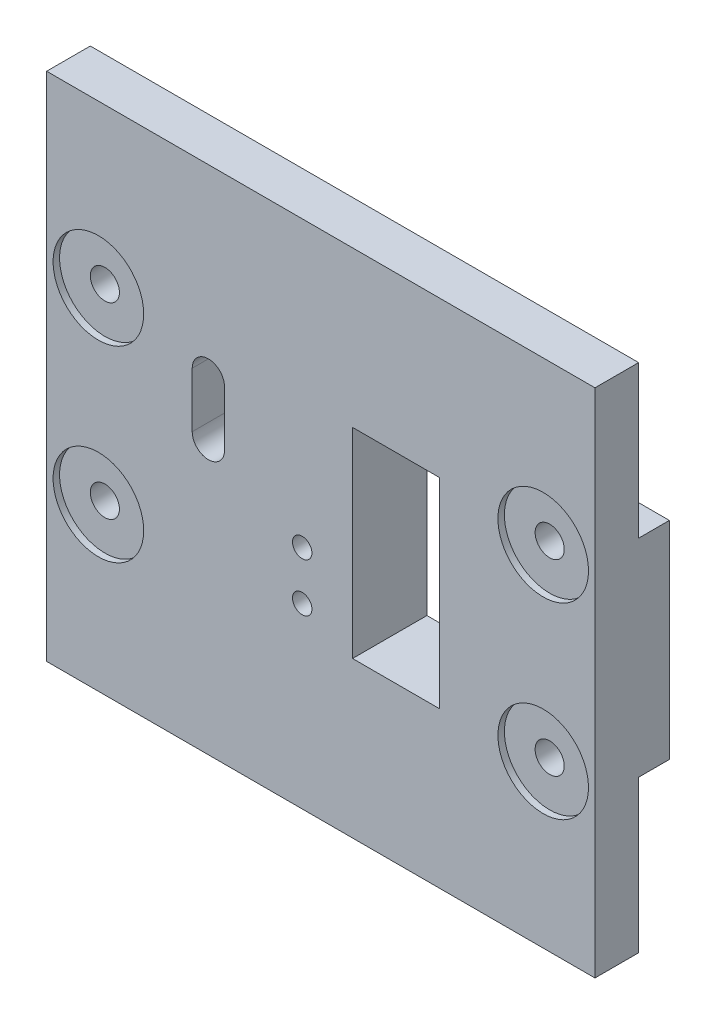
ISO-10303-21;
HEADER;
FILE_DESCRIPTION(('STEP AP214'),'2;1');
FILE_NAME('part.step','',(''),(''),'','','');
FILE_SCHEMA(('AUTOMOTIVE_DESIGN { 1 0 10303 214 1 1 1 1 }'));
ENDSEC;
DATA;
#1=APPLICATION_CONTEXT('core data for automotive mechanical design processes');
#2=APPLICATION_PROTOCOL_DEFINITION('international standard','automotive_design',2000,#1);
#3=PRODUCT_CONTEXT('',#1,'mechanical');
#4=PRODUCT('Part','Part','',(#3));
#5=PRODUCT_RELATED_PRODUCT_CATEGORY('part','',(#4));
#6=PRODUCT_DEFINITION_FORMATION('','',#4);
#7=PRODUCT_DEFINITION_CONTEXT('part definition',#1,'design');
#8=PRODUCT_DEFINITION('design','',#6,#7);
#9=PRODUCT_DEFINITION_SHAPE('','',#8);
#10=(LENGTH_UNIT() NAMED_UNIT(*) SI_UNIT(.MILLI.,.METRE.));
#11=(NAMED_UNIT(*) PLANE_ANGLE_UNIT() SI_UNIT($,.RADIAN.));
#12=(NAMED_UNIT(*) SI_UNIT($,.STERADIAN.) SOLID_ANGLE_UNIT());
#13=UNCERTAINTY_MEASURE_WITH_UNIT(LENGTH_MEASURE(1.E-05),#10,'distance_accuracy_value','');
#14=(GEOMETRIC_REPRESENTATION_CONTEXT(3) GLOBAL_UNCERTAINTY_ASSIGNED_CONTEXT((#13)) GLOBAL_UNIT_ASSIGNED_CONTEXT((#10,
#11,#12)) REPRESENTATION_CONTEXT('',''));
#15=CARTESIAN_POINT('',(0.,0.,0.));
#16=DIRECTION('',(0.,0.,1.));
#17=DIRECTION('',(1.,0.,0.));
#18=AXIS2_PLACEMENT_3D('',#15,#16,#17);
#19=CARTESIAN_POINT('',(0.,0.,23.));
#20=DIRECTION('',(0.,0.,-1.));
#21=DIRECTION('',(-1.,0.,0.));
#22=AXIS2_PLACEMENT_3D('',#19,#20,#21);
#23=PLANE('',#22);
#24=CARTESIAN_POINT('',(103.5,-29.,23.));
#25=DIRECTION('',(0.,0.,1.));
#26=DIRECTION('',(1.,0.,0.));
#27=AXIS2_PLACEMENT_3D('',#24,#25,#26);
#28=CIRCLE('',#27,14.);
#29=CARTESIAN_POINT('',(117.5,-29.,23.));
#30=VERTEX_POINT('',#29);
#31=EDGE_CURVE('E206',#30,#30,#28,.T.);
#32=ORIENTED_EDGE('',*,*,#31,.F.);
#33=EDGE_LOOP('',(#32));
#34=FACE_BOUND('',#33,.T.);
#35=CARTESIAN_POINT('',(-34.,29.0000000000001,23.));
#36=DIRECTION('',(0.,0.,1.));
#37=DIRECTION('',(1.,0.,0.));
#38=AXIS2_PLACEMENT_3D('',#35,#36,#37);
#39=CIRCLE('',#38,14.);
#40=CARTESIAN_POINT('',(-20.,29.0000000000001,23.));
#41=VERTEX_POINT('',#40);
#42=EDGE_CURVE('E213',#41,#41,#39,.T.);
#43=ORIENTED_EDGE('',*,*,#42,.F.);
#44=EDGE_LOOP('',(#43));
#45=FACE_BOUND('',#44,.T.);
#46=CARTESIAN_POINT('',(-34.,-29.,23.));
#47=DIRECTION('',(0.,0.,1.));
#48=DIRECTION('',(1.,0.,0.));
#49=AXIS2_PLACEMENT_3D('',#46,#47,#48);
#50=CIRCLE('',#49,14.);
#51=CARTESIAN_POINT('',(-20.,-29.,23.));
#52=VERTEX_POINT('',#51);
#53=EDGE_CURVE('E200',#52,#52,#50,.T.);
#54=ORIENTED_EDGE('',*,*,#53,.F.);
#55=EDGE_LOOP('',(#54));
#56=FACE_BOUND('',#55,.T.);
#57=CARTESIAN_POINT('',(103.5,29.0000000000001,23.));
#58=DIRECTION('',(0.,0.,1.));
#59=DIRECTION('',(1.,0.,0.));
#60=AXIS2_PLACEMENT_3D('',#57,#58,#59);
#61=CIRCLE('',#60,14.);
#62=CARTESIAN_POINT('',(117.5,29.0000000000001,23.));
#63=VERTEX_POINT('',#62);
#64=EDGE_CURVE('E209',#63,#63,#61,.T.);
#65=ORIENTED_EDGE('',*,*,#64,.F.);
#66=EDGE_LOOP('',(#65));
#67=FACE_BOUND('',#66,.T.);
#68=DIRECTION('',(0.,-1.,0.));
#69=VECTOR('',#68,1.);
#70=CARTESIAN_POINT('',(44.56,30.94,23.));
#71=LINE('',#70,#69);
#72=CARTESIAN_POINT('',(44.56,30.94,23.));
#73=VERTEX_POINT('',#72);
#74=CARTESIAN_POINT('',(44.56,-30.94,23.));
#75=VERTEX_POINT('',#74);
#76=EDGE_CURVE('E306',#73,#75,#71,.T.);
#77=ORIENTED_EDGE('',*,*,#76,.F.);
#78=DIRECTION('',(-1.,0.,0.));
#79=VECTOR('',#78,1.);
#80=CARTESIAN_POINT('',(71.44,30.94,23.));
#81=LINE('',#80,#79);
#82=CARTESIAN_POINT('',(71.44,30.94,23.));
#83=VERTEX_POINT('',#82);
#84=EDGE_CURVE('E314',#83,#73,#81,.T.);
#85=ORIENTED_EDGE('',*,*,#84,.F.);
#86=DIRECTION('',(0.,1.,0.));
#87=VECTOR('',#86,1.);
#88=CARTESIAN_POINT('',(71.44,-30.94,23.));
#89=LINE('',#88,#87);
#90=CARTESIAN_POINT('',(71.44,-30.94,23.));
#91=VERTEX_POINT('',#90);
#92=EDGE_CURVE('E311',#91,#83,#89,.T.);
#93=ORIENTED_EDGE('',*,*,#92,.F.);
#94=DIRECTION('',(1.,0.,0.));
#95=VECTOR('',#94,1.);
#96=CARTESIAN_POINT('',(44.56,-30.94,23.));
#97=LINE('',#96,#95);
#98=EDGE_CURVE('E308',#75,#91,#97,.T.);
#99=ORIENTED_EDGE('',*,*,#98,.F.);
#100=EDGE_LOOP('',(#77,#85,#93,#99));
#101=FACE_BOUND('',#100,.T.);
#102=DIRECTION('',(0.,-1.,0.));
#103=VECTOR('',#102,1.);
#104=CARTESIAN_POINT('',(-50.,-79.,23.));
#105=LINE('',#104,#103);
#106=CARTESIAN_POINT('',(-50.,79.0000000000001,23.));
#107=VERTEX_POINT('',#106);
#108=CARTESIAN_POINT('',(-50.,-79.,23.));
#109=VERTEX_POINT('',#108);
#110=EDGE_CURVE('E349',#107,#109,#105,.T.);
#111=ORIENTED_EDGE('',*,*,#110,.T.);
#112=DIRECTION('',(1.,0.,0.));
#113=VECTOR('',#112,1.);
#114=CARTESIAN_POINT('',(-50.,-79.,23.));
#115=LINE('',#114,#113);
#116=CARTESIAN_POINT('',(119.5,-79.,23.));
#117=VERTEX_POINT('',#116);
#118=EDGE_CURVE('E352',#109,#117,#115,.T.);
#119=ORIENTED_EDGE('',*,*,#118,.T.);
#120=DIRECTION('',(0.,1.,0.));
#121=VECTOR('',#120,1.);
#122=CARTESIAN_POINT('',(119.5,-79.,23.));
#123=LINE('',#122,#121);
#124=CARTESIAN_POINT('',(119.5,79.0000000000001,23.));
#125=VERTEX_POINT('',#124);
#126=EDGE_CURVE('E355',#117,#125,#123,.T.);
#127=ORIENTED_EDGE('',*,*,#126,.T.);
#128=DIRECTION('',(-1.,0.,0.));
#129=VECTOR('',#128,1.);
#130=CARTESIAN_POINT('',(-50.,79.0000000000001,23.));
#131=LINE('',#130,#129);
#132=EDGE_CURVE('E357',#125,#107,#131,.T.);
#133=ORIENTED_EDGE('',*,*,#132,.T.);
#134=EDGE_LOOP('',(#111,#119,#127,#133));
#135=FACE_BOUND('',#134,.T.);
#136=CARTESIAN_POINT('',(29.,-8.99999999999998,23.));
#137=DIRECTION('',(0.,0.,1.));
#138=DIRECTION('',(1.,0.,0.));
#139=AXIS2_PLACEMENT_3D('',#136,#137,#138);
#140=CIRCLE('',#139,3.);
#141=CARTESIAN_POINT('',(32.,-8.99999999999998,23.));
#142=VERTEX_POINT('',#141);
#143=EDGE_CURVE('E343',#142,#142,#140,.T.);
#144=ORIENTED_EDGE('',*,*,#143,.F.);
#145=EDGE_LOOP('',(#144));
#146=FACE_BOUND('',#145,.T.);
#147=CARTESIAN_POINT('',(29.,-24.,23.));
#148=DIRECTION('',(0.,0.,1.));
#149=DIRECTION('',(1.,0.,0.));
#150=AXIS2_PLACEMENT_3D('',#147,#148,#149);
#151=CIRCLE('',#150,3.);
#152=CARTESIAN_POINT('',(32.,-24.,23.));
#153=VERTEX_POINT('',#152);
#154=EDGE_CURVE('E337',#153,#153,#151,.T.);
#155=ORIENTED_EDGE('',*,*,#154,.F.);
#156=EDGE_LOOP('',(#155));
#157=FACE_BOUND('',#156,.T.);
#158=CARTESIAN_POINT('',(0.,22.,23.));
#159=DIRECTION('',(0.,0.,1.));
#160=DIRECTION('',(1.,0.,0.));
#161=AXIS2_PLACEMENT_3D('',#158,#159,#160);
#162=CIRCLE('',#161,5.);
#163=CARTESIAN_POINT('',(5.,22.,23.));
#164=VERTEX_POINT('',#163);
#165=CARTESIAN_POINT('',(-5.,22.,23.));
#166=VERTEX_POINT('',#165);
#167=EDGE_CURVE('E275',#164,#166,#162,.T.);
#168=ORIENTED_EDGE('',*,*,#167,.F.);
#169=DIRECTION('',(0.,1.,0.));
#170=VECTOR('',#169,1.);
#171=CARTESIAN_POINT('',(5.,5.00000000000001,23.));
#172=LINE('',#171,#170);
#173=CARTESIAN_POINT('',(5.,5.00000000000001,23.));
#174=VERTEX_POINT('',#173);
#175=EDGE_CURVE('E283',#174,#164,#172,.T.);
#176=ORIENTED_EDGE('',*,*,#175,.F.);
#177=CARTESIAN_POINT('',(0.,5.00000000000001,23.));
#178=DIRECTION('',(0.,0.,1.));
#179=DIRECTION('',(1.,0.,0.));
#180=AXIS2_PLACEMENT_3D('',#177,#178,#179);
#181=CIRCLE('',#180,5.);
#182=CARTESIAN_POINT('',(-5.,5.00000000000002,23.));
#183=VERTEX_POINT('',#182);
#184=EDGE_CURVE('E280',#183,#174,#181,.T.);
#185=ORIENTED_EDGE('',*,*,#184,.F.);
#186=DIRECTION('',(0.,-1.,0.));
#187=VECTOR('',#186,1.);
#188=CARTESIAN_POINT('',(-5.,22.,23.));
#189=LINE('',#188,#187);
#190=EDGE_CURVE('E277',#166,#183,#189,.T.);
#191=ORIENTED_EDGE('',*,*,#190,.F.);
#192=EDGE_LOOP('',(#168,#176,#185,#191));
#193=FACE_BOUND('',#192,.T.);
#194=ADVANCED_FACE('F43',(#34,#45,#56,#67,#101,#135,#146,#157,#193),#23,.F.);
#195=CARTESIAN_POINT('',(0.,0.,0.));
#196=DIRECTION('',(0.,0.,-1.));
#197=DIRECTION('',(-1.,0.,0.));
#198=AXIS2_PLACEMENT_3D('',#195,#196,#197);
#199=PLANE('',#198);
#200=CARTESIAN_POINT('',(74.5,-27.,0.));
#201=DIRECTION('',(0.,0.,1.));
#202=DIRECTION('',(1.,0.,0.));
#203=AXIS2_PLACEMENT_3D('',#200,#201,#202);
#204=CIRCLE('',#203,2.);
#205=CARTESIAN_POINT('',(76.5,-27.,0.));
#206=VERTEX_POINT('',#205);
#207=EDGE_CURVE('E228',#206,#206,#204,.T.);
#208=ORIENTED_EDGE('',*,*,#207,.T.);
#209=EDGE_LOOP('',(#208));
#210=FACE_BOUND('',#209,.T.);
#211=CARTESIAN_POINT('',(74.5,23.,0.));
#212=DIRECTION('',(0.,0.,1.));
#213=DIRECTION('',(1.,0.,0.));
#214=AXIS2_PLACEMENT_3D('',#211,#212,#213);
#215=CIRCLE('',#214,2.);
#216=CARTESIAN_POINT('',(76.5,23.,0.));
#217=VERTEX_POINT('',#216);
#218=EDGE_CURVE('E231',#217,#217,#215,.T.);
#219=ORIENTED_EDGE('',*,*,#218,.T.);
#220=EDGE_LOOP('',(#219));
#221=FACE_BOUND('',#220,.T.);
#222=CARTESIAN_POINT('',(27.,18.5,0.));
#223=DIRECTION('',(0.,0.,1.));
#224=DIRECTION('',(1.,0.,0.));
#225=AXIS2_PLACEMENT_3D('',#222,#223,#224);
#226=CIRCLE('',#225,2.00000000000001);
#227=CARTESIAN_POINT('',(29.,18.5,0.));
#228=VERTEX_POINT('',#227);
#229=EDGE_CURVE('E237',#228,#228,#226,.T.);
#230=ORIENTED_EDGE('',*,*,#229,.T.);
#231=EDGE_LOOP('',(#230));
#232=FACE_BOUND('',#231,.T.);
#233=CARTESIAN_POINT('',(27.,8.50000000000001,0.));
#234=DIRECTION('',(0.,0.,1.));
#235=DIRECTION('',(1.,0.,0.));
#236=AXIS2_PLACEMENT_3D('',#233,#234,#235);
#237=CIRCLE('',#236,2.);
#238=CARTESIAN_POINT('',(29.,8.50000000000001,0.));
#239=VERTEX_POINT('',#238);
#240=EDGE_CURVE('E243',#239,#239,#237,.T.);
#241=ORIENTED_EDGE('',*,*,#240,.T.);
#242=EDGE_LOOP('',(#241));
#243=FACE_BOUND('',#242,.T.);
#244=DIRECTION('',(1.,0.,0.));
#245=VECTOR('',#244,1.);
#246=CARTESIAN_POINT('',(-50.,32.,0.));
#247=LINE('',#246,#245);
#248=CARTESIAN_POINT('',(-50.,32.,0.));
#249=VERTEX_POINT('',#248);
#250=CARTESIAN_POINT('',(119.5,32.,0.));
#251=VERTEX_POINT('',#250);
#252=EDGE_CURVE('E257',#249,#251,#247,.T.);
#253=ORIENTED_EDGE('',*,*,#252,.T.);
#254=DIRECTION('',(0.,1.,0.));
#255=VECTOR('',#254,1.);
#256=CARTESIAN_POINT('',(119.5,-79.,0.));
#257=LINE('',#256,#255);
#258=CARTESIAN_POINT('',(119.5,-32.,0.));
#259=VERTEX_POINT('',#258);
#260=EDGE_CURVE('E353',#259,#251,#257,.T.);
#261=ORIENTED_EDGE('',*,*,#260,.F.);
#262=DIRECTION('',(1.,0.,0.));
#263=VECTOR('',#262,1.);
#264=CARTESIAN_POINT('',(-50.,-32.,0.));
#265=LINE('',#264,#263);
#266=CARTESIAN_POINT('',(-50.,-32.,0.));
#267=VERTEX_POINT('',#266);
#268=EDGE_CURVE('E227',#267,#259,#265,.T.);
#269=ORIENTED_EDGE('',*,*,#268,.F.);
#270=DIRECTION('',(0.,-1.,0.));
#271=VECTOR('',#270,1.);
#272=CARTESIAN_POINT('',(-50.,-79.,0.));
#273=LINE('',#272,#271);
#274=EDGE_CURVE('E346',#249,#267,#273,.T.);
#275=ORIENTED_EDGE('',*,*,#274,.F.);
#276=EDGE_LOOP('',(#253,#261,#269,#275));
#277=FACE_BOUND('',#276,.T.);
#278=CARTESIAN_POINT('',(29.,-8.99999999999998,0.));
#279=DIRECTION('',(0.,0.,1.));
#280=DIRECTION('',(1.,0.,0.));
#281=AXIS2_PLACEMENT_3D('',#278,#279,#280);
#282=CIRCLE('',#281,3.);
#283=CARTESIAN_POINT('',(32.,-8.99999999999998,0.));
#284=VERTEX_POINT('',#283);
#285=EDGE_CURVE('E340',#284,#284,#282,.T.);
#286=ORIENTED_EDGE('',*,*,#285,.T.);
#287=EDGE_LOOP('',(#286));
#288=FACE_BOUND('',#287,.T.);
#289=CARTESIAN_POINT('',(29.,-24.,0.));
#290=DIRECTION('',(0.,0.,1.));
#291=DIRECTION('',(1.,0.,0.));
#292=AXIS2_PLACEMENT_3D('',#289,#290,#291);
#293=CIRCLE('',#292,3.);
#294=CARTESIAN_POINT('',(32.,-24.,0.));
#295=VERTEX_POINT('',#294);
#296=EDGE_CURVE('E336',#295,#295,#293,.T.);
#297=ORIENTED_EDGE('',*,*,#296,.T.);
#298=EDGE_LOOP('',(#297));
#299=FACE_BOUND('',#298,.T.);
#300=DIRECTION('',(-1.,0.,0.));
#301=VECTOR('',#300,1.);
#302=CARTESIAN_POINT('',(71.44,30.94,0.));
#303=LINE('',#302,#301);
#304=CARTESIAN_POINT('',(71.44,30.94,0.));
#305=VERTEX_POINT('',#304);
#306=CARTESIAN_POINT('',(44.56,30.94,0.));
#307=VERTEX_POINT('',#306);
#308=EDGE_CURVE('E309',#305,#307,#303,.T.);
#309=ORIENTED_EDGE('',*,*,#308,.T.);
#310=DIRECTION('',(0.,-1.,0.));
#311=VECTOR('',#310,1.);
#312=CARTESIAN_POINT('',(44.56,30.94,0.));
#313=LINE('',#312,#311);
#314=CARTESIAN_POINT('',(44.56,-30.94,0.));
#315=VERTEX_POINT('',#314);
#316=EDGE_CURVE('E305',#307,#315,#313,.T.);
#317=ORIENTED_EDGE('',*,*,#316,.T.);
#318=DIRECTION('',(1.,0.,0.));
#319=VECTOR('',#318,1.);
#320=CARTESIAN_POINT('',(44.56,-30.94,0.));
#321=LINE('',#320,#319);
#322=CARTESIAN_POINT('',(71.44,-30.94,0.));
#323=VERTEX_POINT('',#322);
#324=EDGE_CURVE('E319',#315,#323,#321,.T.);
#325=ORIENTED_EDGE('',*,*,#324,.T.);
#326=DIRECTION('',(0.,1.,0.));
#327=VECTOR('',#326,1.);
#328=CARTESIAN_POINT('',(71.44,-30.94,0.));
#329=LINE('',#328,#327);
#330=EDGE_CURVE('E322',#323,#305,#329,.T.);
#331=ORIENTED_EDGE('',*,*,#330,.T.);
#332=EDGE_LOOP('',(#309,#317,#325,#331));
#333=FACE_BOUND('',#332,.T.);
#334=DIRECTION('',(0.,1.,0.));
#335=VECTOR('',#334,1.);
#336=CARTESIAN_POINT('',(5.,5.00000000000001,0.));
#337=LINE('',#336,#335);
#338=CARTESIAN_POINT('',(5.,5.00000000000001,0.));
#339=VERTEX_POINT('',#338);
#340=CARTESIAN_POINT('',(5.,22.,0.));
#341=VERTEX_POINT('',#340);
#342=EDGE_CURVE('E278',#339,#341,#337,.T.);
#343=ORIENTED_EDGE('',*,*,#342,.T.);
#344=CARTESIAN_POINT('',(0.,22.,0.));
#345=DIRECTION('',(0.,0.,1.));
#346=DIRECTION('',(1.,0.,0.));
#347=AXIS2_PLACEMENT_3D('',#344,#345,#346);
#348=CIRCLE('',#347,5.);
#349=CARTESIAN_POINT('',(-5.,22.,0.));
#350=VERTEX_POINT('',#349);
#351=EDGE_CURVE('E274',#341,#350,#348,.T.);
#352=ORIENTED_EDGE('',*,*,#351,.T.);
#353=DIRECTION('',(0.,-1.,0.));
#354=VECTOR('',#353,1.);
#355=CARTESIAN_POINT('',(-5.,22.,0.));
#356=LINE('',#355,#354);
#357=CARTESIAN_POINT('',(-5.,5.00000000000002,0.));
#358=VERTEX_POINT('',#357);
#359=EDGE_CURVE('E288',#350,#358,#356,.T.);
#360=ORIENTED_EDGE('',*,*,#359,.T.);
#361=CARTESIAN_POINT('',(0.,5.00000000000001,0.));
#362=DIRECTION('',(0.,0.,1.));
#363=DIRECTION('',(1.,0.,0.));
#364=AXIS2_PLACEMENT_3D('',#361,#362,#363);
#365=CIRCLE('',#364,5.);
#366=EDGE_CURVE('E291',#358,#339,#365,.T.);
#367=ORIENTED_EDGE('',*,*,#366,.T.);
#368=EDGE_LOOP('',(#343,#352,#360,#367));
#369=FACE_BOUND('',#368,.T.);
#370=ADVANCED_FACE('F384',(#210,#221,#232,#243,#277,#288,#299,#333,#369),#199,.T.);
#371=CARTESIAN_POINT('',(-50.,-79.,23.));
#372=DIRECTION('',(1.,0.,0.));
#373=DIRECTION('',(0.,0.,-1.));
#374=AXIS2_PLACEMENT_3D('',#371,#372,#373);
#375=PLANE('',#374);
#376=DIRECTION('',(0.,0.,-1.));
#377=VECTOR('',#376,1.);
#378=CARTESIAN_POINT('',(-50.,79.0000000000001,23.));
#379=LINE('',#378,#377);
#380=CARTESIAN_POINT('',(-50.,79.0000000000001,9.5));
#381=VERTEX_POINT('',#380);
#382=EDGE_CURVE('E359',#107,#381,#379,.T.);
#383=ORIENTED_EDGE('',*,*,#382,.T.);
#384=DIRECTION('',(0.,-1.,0.));
#385=VECTOR('',#384,1.);
#386=CARTESIAN_POINT('',(-50.,32.,9.5));
#387=LINE('',#386,#385);
#388=CARTESIAN_POINT('',(-50.,32.,9.5));
#389=VERTEX_POINT('',#388);
#390=EDGE_CURVE('E66',#381,#389,#387,.T.);
#391=ORIENTED_EDGE('',*,*,#390,.T.);
#392=DIRECTION('',(0.,0.,-1.));
#393=VECTOR('',#392,1.);
#394=CARTESIAN_POINT('',(-50.,32.,9.5));
#395=LINE('',#394,#393);
#396=EDGE_CURVE('E249',#389,#249,#395,.T.);
#397=ORIENTED_EDGE('',*,*,#396,.T.);
#398=ORIENTED_EDGE('',*,*,#274,.T.);
#399=DIRECTION('',(0.,0.,1.));
#400=VECTOR('',#399,1.);
#401=CARTESIAN_POINT('',(-50.,-32.,9.5));
#402=LINE('',#401,#400);
#403=CARTESIAN_POINT('',(-50.,-32.,9.5));
#404=VERTEX_POINT('',#403);
#405=EDGE_CURVE('E250',#267,#404,#402,.T.);
#406=ORIENTED_EDGE('',*,*,#405,.T.);
#407=DIRECTION('',(0.,-1.,0.));
#408=VECTOR('',#407,1.);
#409=CARTESIAN_POINT('',(-50.,-32.,9.5));
#410=LINE('',#409,#408);
#411=CARTESIAN_POINT('',(-50.,-79.0000000000001,9.5));
#412=VERTEX_POINT('',#411);
#413=EDGE_CURVE('E263',#404,#412,#410,.T.);
#414=ORIENTED_EDGE('',*,*,#413,.T.);
#415=DIRECTION('',(0.,0.,-1.));
#416=VECTOR('',#415,1.);
#417=CARTESIAN_POINT('',(-50.,-79.,23.));
#418=LINE('',#417,#416);
#419=EDGE_CURVE('E372',#109,#412,#418,.T.);
#420=ORIENTED_EDGE('',*,*,#419,.F.);
#421=ORIENTED_EDGE('',*,*,#110,.F.);
#422=EDGE_LOOP('',(#383,#391,#397,#398,#406,#414,#420,#421));
#423=FACE_BOUND('',#422,.T.);
#424=ADVANCED_FACE('F45',(#423),#375,.F.);
#425=CARTESIAN_POINT('',(-50.,-79.,23.));
#426=DIRECTION('',(0.,1.,0.));
#427=DIRECTION('',(0.,0.,1.));
#428=AXIS2_PLACEMENT_3D('',#425,#426,#427);
#429=PLANE('',#428);
#430=ORIENTED_EDGE('',*,*,#419,.T.);
#431=DIRECTION('',(1.,0.,0.));
#432=VECTOR('',#431,1.);
#433=CARTESIAN_POINT('',(-50.,-79.0000000000001,9.5));
#434=LINE('',#433,#432);
#435=CARTESIAN_POINT('',(119.5,-79.0000000000001,9.5));
#436=VERTEX_POINT('',#435);
#437=EDGE_CURVE('E264',#412,#436,#434,.T.);
#438=ORIENTED_EDGE('',*,*,#437,.T.);
#439=DIRECTION('',(0.,0.,-1.));
#440=VECTOR('',#439,1.);
#441=CARTESIAN_POINT('',(119.5,-79.,23.));
#442=LINE('',#441,#440);
#443=EDGE_CURVE('E369',#117,#436,#442,.T.);
#444=ORIENTED_EDGE('',*,*,#443,.F.);
#445=ORIENTED_EDGE('',*,*,#118,.F.);
#446=EDGE_LOOP('',(#430,#438,#444,#445));
#447=FACE_BOUND('',#446,.T.);
#448=ADVANCED_FACE('F404',(#447),#429,.F.);
#449=CARTESIAN_POINT('',(119.5,-79.,23.));
#450=DIRECTION('',(-1.,0.,0.));
#451=DIRECTION('',(0.,0.,1.));
#452=AXIS2_PLACEMENT_3D('',#449,#450,#451);
#453=PLANE('',#452);
#454=DIRECTION('',(0.,0.,1.));
#455=VECTOR('',#454,1.);
#456=CARTESIAN_POINT('',(119.5,32.,23.));
#457=LINE('',#456,#455);
#458=CARTESIAN_POINT('',(119.5,32.,9.5));
#459=VERTEX_POINT('',#458);
#460=EDGE_CURVE('E11',#251,#459,#457,.T.);
#461=ORIENTED_EDGE('',*,*,#460,.T.);
#462=DIRECTION('',(0.,1.,0.));
#463=VECTOR('',#462,1.);
#464=CARTESIAN_POINT('',(119.5,-79.,9.5));
#465=LINE('',#464,#463);
#466=CARTESIAN_POINT('',(119.5,79.0000000000001,9.5));
#467=VERTEX_POINT('',#466);
#468=EDGE_CURVE('E256',#459,#467,#465,.T.);
#469=ORIENTED_EDGE('',*,*,#468,.T.);
#470=DIRECTION('',(0.,0.,-1.));
#471=VECTOR('',#470,1.);
#472=CARTESIAN_POINT('',(119.5,79.0000000000001,23.));
#473=LINE('',#472,#471);
#474=EDGE_CURVE('E366',#125,#467,#473,.T.);
#475=ORIENTED_EDGE('',*,*,#474,.F.);
#476=ORIENTED_EDGE('',*,*,#126,.F.);
#477=ORIENTED_EDGE('',*,*,#443,.T.);
#478=DIRECTION('',(0.,1.,0.));
#479=VECTOR('',#478,1.);
#480=CARTESIAN_POINT('',(119.5,-79.,9.5));
#481=LINE('',#480,#479);
#482=CARTESIAN_POINT('',(119.5,-32.,9.5));
#483=VERTEX_POINT('',#482);
#484=EDGE_CURVE('E375',#436,#483,#481,.T.);
#485=ORIENTED_EDGE('',*,*,#484,.T.);
#486=DIRECTION('',(0.,0.,-1.));
#487=VECTOR('',#486,1.);
#488=CARTESIAN_POINT('',(119.5,-32.,23.));
#489=LINE('',#488,#487);
#490=EDGE_CURVE('E51',#483,#259,#489,.T.);
#491=ORIENTED_EDGE('',*,*,#490,.T.);
#492=ORIENTED_EDGE('',*,*,#260,.T.);
#493=EDGE_LOOP('',(#461,#469,#475,#476,#477,#485,#491,#492));
#494=FACE_BOUND('',#493,.T.);
#495=ADVANCED_FACE('F380',(#494),#453,.F.);
#496=CARTESIAN_POINT('',(-50.,79.0000000000001,23.));
#497=DIRECTION('',(0.,-1.,0.));
#498=DIRECTION('',(0.,0.,-1.));
#499=AXIS2_PLACEMENT_3D('',#496,#497,#498);
#500=PLANE('',#499);
#501=ORIENTED_EDGE('',*,*,#474,.T.);
#502=DIRECTION('',(1.,0.,0.));
#503=VECTOR('',#502,1.);
#504=CARTESIAN_POINT('',(-50.,79.0000000000001,9.5));
#505=LINE('',#504,#503);
#506=EDGE_CURVE('E254',#381,#467,#505,.T.);
#507=ORIENTED_EDGE('',*,*,#506,.F.);
#508=ORIENTED_EDGE('',*,*,#382,.F.);
#509=ORIENTED_EDGE('',*,*,#132,.F.);
#510=EDGE_LOOP('',(#501,#507,#508,#509));
#511=FACE_BOUND('',#510,.T.);
#512=ADVANCED_FACE('F396',(#511),#500,.F.);
#513=CARTESIAN_POINT('',(29.,-8.99999999999998,23.));
#514=DIRECTION('',(0.,0.,-1.));
#515=DIRECTION('',(-1.,0.,0.));
#516=AXIS2_PLACEMENT_3D('',#513,#514,#515);
#517=CYLINDRICAL_SURFACE('',#516,3.);
#518=ORIENTED_EDGE('',*,*,#143,.T.);
#519=EDGE_LOOP('',(#518));
#520=FACE_BOUND('',#519,.T.);
#521=ORIENTED_EDGE('',*,*,#285,.F.);
#522=EDGE_LOOP('',(#521));
#523=FACE_BOUND('',#522,.T.);
#524=ADVANCED_FACE('F427',(#520,#523),#517,.F.);
#525=CARTESIAN_POINT('',(29.,-24.,23.));
#526=DIRECTION('',(0.,0.,-1.));
#527=DIRECTION('',(-1.,0.,0.));
#528=AXIS2_PLACEMENT_3D('',#525,#526,#527);
#529=CYLINDRICAL_SURFACE('',#528,3.);
#530=ORIENTED_EDGE('',*,*,#154,.T.);
#531=EDGE_LOOP('',(#530));
#532=FACE_BOUND('',#531,.T.);
#533=ORIENTED_EDGE('',*,*,#296,.F.);
#534=EDGE_LOOP('',(#533));
#535=FACE_BOUND('',#534,.T.);
#536=ADVANCED_FACE('F875',(#532,#535),#529,.F.);
#537=CARTESIAN_POINT('',(44.56,30.94,23.));
#538=DIRECTION('',(1.,0.,0.));
#539=DIRECTION('',(0.,0.,-1.));
#540=AXIS2_PLACEMENT_3D('',#537,#538,#539);
#541=PLANE('',#540);
#542=ORIENTED_EDGE('',*,*,#316,.F.);
#543=DIRECTION('',(0.,0.,-1.));
#544=VECTOR('',#543,1.);
#545=CARTESIAN_POINT('',(44.56,30.94,23.));
#546=LINE('',#545,#544);
#547=EDGE_CURVE('E316',#73,#307,#546,.T.);
#548=ORIENTED_EDGE('',*,*,#547,.F.);
#549=ORIENTED_EDGE('',*,*,#76,.T.);
#550=DIRECTION('',(0.,0.,-1.));
#551=VECTOR('',#550,1.);
#552=CARTESIAN_POINT('',(44.56,-30.94,23.));
#553=LINE('',#552,#551);
#554=EDGE_CURVE('E333',#75,#315,#553,.T.);
#555=ORIENTED_EDGE('',*,*,#554,.T.);
#556=EDGE_LOOP('',(#542,#548,#549,#555));
#557=FACE_BOUND('',#556,.T.);
#558=ADVANCED_FACE('F865',(#557),#541,.T.);
#559=CARTESIAN_POINT('',(44.56,-30.94,23.));
#560=DIRECTION('',(0.,1.,0.));
#561=DIRECTION('',(0.,0.,1.));
#562=AXIS2_PLACEMENT_3D('',#559,#560,#561);
#563=PLANE('',#562);
#564=ORIENTED_EDGE('',*,*,#324,.F.);
#565=ORIENTED_EDGE('',*,*,#554,.F.);
#566=ORIENTED_EDGE('',*,*,#98,.T.);
#567=DIRECTION('',(0.,0.,-1.));
#568=VECTOR('',#567,1.);
#569=CARTESIAN_POINT('',(71.44,-30.94,23.));
#570=LINE('',#569,#568);
#571=EDGE_CURVE('E331',#91,#323,#570,.T.);
#572=ORIENTED_EDGE('',*,*,#571,.T.);
#573=EDGE_LOOP('',(#564,#565,#566,#572));
#574=FACE_BOUND('',#573,.T.);
#575=ADVANCED_FACE('F855',(#574),#563,.T.);
#576=CARTESIAN_POINT('',(71.44,-30.94,23.));
#577=DIRECTION('',(-1.,0.,0.));
#578=DIRECTION('',(0.,0.,1.));
#579=AXIS2_PLACEMENT_3D('',#576,#577,#578);
#580=PLANE('',#579);
#581=ORIENTED_EDGE('',*,*,#330,.F.);
#582=ORIENTED_EDGE('',*,*,#571,.F.);
#583=ORIENTED_EDGE('',*,*,#92,.T.);
#584=DIRECTION('',(0.,0.,-1.));
#585=VECTOR('',#584,1.);
#586=CARTESIAN_POINT('',(71.44,30.94,23.));
#587=LINE('',#586,#585);
#588=EDGE_CURVE('E329',#83,#305,#587,.T.);
#589=ORIENTED_EDGE('',*,*,#588,.T.);
#590=EDGE_LOOP('',(#581,#582,#583,#589));
#591=FACE_BOUND('',#590,.T.);
#592=ADVANCED_FACE('F845',(#591),#580,.T.);
#593=CARTESIAN_POINT('',(71.44,30.94,23.));
#594=DIRECTION('',(0.,-1.,0.));
#595=DIRECTION('',(0.,0.,-1.));
#596=AXIS2_PLACEMENT_3D('',#593,#594,#595);
#597=PLANE('',#596);
#598=ORIENTED_EDGE('',*,*,#308,.F.);
#599=ORIENTED_EDGE('',*,*,#588,.F.);
#600=ORIENTED_EDGE('',*,*,#84,.T.);
#601=ORIENTED_EDGE('',*,*,#547,.T.);
#602=EDGE_LOOP('',(#598,#599,#600,#601));
#603=FACE_BOUND('',#602,.T.);
#604=ADVANCED_FACE('F835',(#603),#597,.T.);
#605=CARTESIAN_POINT('',(0.,22.,23.));
#606=DIRECTION('',(0.,0.,-1.));
#607=DIRECTION('',(-1.,0.,0.));
#608=AXIS2_PLACEMENT_3D('',#605,#606,#607);
#609=CYLINDRICAL_SURFACE('',#608,5.);
#610=ORIENTED_EDGE('',*,*,#351,.F.);
#611=DIRECTION('',(0.,0.,-1.));
#612=VECTOR('',#611,1.);
#613=CARTESIAN_POINT('',(5.,22.,23.));
#614=LINE('',#613,#612);
#615=EDGE_CURVE('E285',#164,#341,#614,.T.);
#616=ORIENTED_EDGE('',*,*,#615,.F.);
#617=ORIENTED_EDGE('',*,*,#167,.T.);
#618=DIRECTION('',(0.,0.,-1.));
#619=VECTOR('',#618,1.);
#620=CARTESIAN_POINT('',(-5.,22.,23.));
#621=LINE('',#620,#619);
#622=EDGE_CURVE('E302',#166,#350,#621,.T.);
#623=ORIENTED_EDGE('',*,*,#622,.T.);
#624=EDGE_LOOP('',(#610,#616,#617,#623));
#625=FACE_BOUND('',#624,.T.);
#626=ADVANCED_FACE('F825',(#625),#609,.F.);
#627=CARTESIAN_POINT('',(-5.,22.,23.));
#628=DIRECTION('',(1.,0.,0.));
#629=DIRECTION('',(0.,1.,0.));
#630=AXIS2_PLACEMENT_3D('',#627,#628,#629);
#631=PLANE('',#630);
#632=ORIENTED_EDGE('',*,*,#359,.F.);
#633=ORIENTED_EDGE('',*,*,#622,.F.);
#634=ORIENTED_EDGE('',*,*,#190,.T.);
#635=DIRECTION('',(0.,0.,-1.));
#636=VECTOR('',#635,1.);
#637=CARTESIAN_POINT('',(-5.,5.00000000000002,23.));
#638=LINE('',#637,#636);
#639=EDGE_CURVE('E300',#183,#358,#638,.T.);
#640=ORIENTED_EDGE('',*,*,#639,.T.);
#641=EDGE_LOOP('',(#632,#633,#634,#640));
#642=FACE_BOUND('',#641,.T.);
#643=ADVANCED_FACE('F815',(#642),#631,.T.);
#644=CARTESIAN_POINT('',(0.,5.00000000000001,23.));
#645=DIRECTION('',(0.,0.,-1.));
#646=DIRECTION('',(-1.,0.,0.));
#647=AXIS2_PLACEMENT_3D('',#644,#645,#646);
#648=CYLINDRICAL_SURFACE('',#647,5.);
#649=ORIENTED_EDGE('',*,*,#366,.F.);
#650=ORIENTED_EDGE('',*,*,#639,.F.);
#651=ORIENTED_EDGE('',*,*,#184,.T.);
#652=DIRECTION('',(0.,0.,-1.));
#653=VECTOR('',#652,1.);
#654=CARTESIAN_POINT('',(5.,5.00000000000001,23.));
#655=LINE('',#654,#653);
#656=EDGE_CURVE('E298',#174,#339,#655,.T.);
#657=ORIENTED_EDGE('',*,*,#656,.T.);
#658=EDGE_LOOP('',(#649,#650,#651,#657));
#659=FACE_BOUND('',#658,.T.);
#660=ADVANCED_FACE('F806',(#659),#648,.F.);
#661=CARTESIAN_POINT('',(5.,5.00000000000001,23.));
#662=DIRECTION('',(-1.,0.,0.));
#663=DIRECTION('',(0.,-1.,0.));
#664=AXIS2_PLACEMENT_3D('',#661,#662,#663);
#665=PLANE('',#664);
#666=ORIENTED_EDGE('',*,*,#342,.F.);
#667=ORIENTED_EDGE('',*,*,#656,.F.);
#668=ORIENTED_EDGE('',*,*,#175,.T.);
#669=ORIENTED_EDGE('',*,*,#615,.T.);
#670=EDGE_LOOP('',(#666,#667,#668,#669));
#671=FACE_BOUND('',#670,.T.);
#672=ADVANCED_FACE('F797',(#671),#665,.T.);
#673=CARTESIAN_POINT('',(-50.,32.,9.5));
#674=DIRECTION('',(0.,-1.,0.));
#675=DIRECTION('',(0.,0.,-1.));
#676=AXIS2_PLACEMENT_3D('',#673,#674,#675);
#677=PLANE('',#676);
#678=ORIENTED_EDGE('',*,*,#252,.F.);
#679=ORIENTED_EDGE('',*,*,#396,.F.);
#680=DIRECTION('',(1.,0.,0.));
#681=VECTOR('',#680,1.);
#682=CARTESIAN_POINT('',(-50.,32.,9.5));
#683=LINE('',#682,#681);
#684=EDGE_CURVE('E253',#389,#459,#683,.T.);
#685=ORIENTED_EDGE('',*,*,#684,.T.);
#686=ORIENTED_EDGE('',*,*,#460,.F.);
#687=EDGE_LOOP('',(#678,#679,#685,#686));
#688=FACE_BOUND('',#687,.T.);
#689=ADVANCED_FACE('F389',(#688),#677,.F.);
#690=CARTESIAN_POINT('',(-50.,32.,9.5));
#691=DIRECTION('',(0.,0.,1.));
#692=DIRECTION('',(1.,0.,0.));
#693=AXIS2_PLACEMENT_3D('',#690,#691,#692);
#694=PLANE('',#693);
#695=ORIENTED_EDGE('',*,*,#684,.F.);
#696=ORIENTED_EDGE('',*,*,#390,.F.);
#697=ORIENTED_EDGE('',*,*,#506,.T.);
#698=ORIENTED_EDGE('',*,*,#468,.F.);
#699=EDGE_LOOP('',(#695,#696,#697,#698));
#700=FACE_BOUND('',#699,.T.);
#701=ADVANCED_FACE('F398',(#700),#694,.F.);
#702=CARTESIAN_POINT('',(-50.,-32.,9.5));
#703=DIRECTION('',(0.,1.,0.));
#704=DIRECTION('',(0.,0.,1.));
#705=AXIS2_PLACEMENT_3D('',#702,#703,#704);
#706=PLANE('',#705);
#707=DIRECTION('',(1.,0.,0.));
#708=VECTOR('',#707,1.);
#709=CARTESIAN_POINT('',(-50.,-32.,9.5));
#710=LINE('',#709,#708);
#711=EDGE_CURVE('E58',#404,#483,#710,.T.);
#712=ORIENTED_EDGE('',*,*,#711,.F.);
#713=ORIENTED_EDGE('',*,*,#405,.F.);
#714=ORIENTED_EDGE('',*,*,#268,.T.);
#715=ORIENTED_EDGE('',*,*,#490,.F.);
#716=EDGE_LOOP('',(#712,#713,#714,#715));
#717=FACE_BOUND('',#716,.T.);
#718=ADVANCED_FACE('F406',(#717),#706,.F.);
#719=CARTESIAN_POINT('',(-50.,-32.,9.5));
#720=DIRECTION('',(0.,0.,1.));
#721=DIRECTION('',(1.,0.,0.));
#722=AXIS2_PLACEMENT_3D('',#719,#720,#721);
#723=PLANE('',#722);
#724=ORIENTED_EDGE('',*,*,#437,.F.);
#725=ORIENTED_EDGE('',*,*,#413,.F.);
#726=ORIENTED_EDGE('',*,*,#711,.T.);
#727=ORIENTED_EDGE('',*,*,#484,.F.);
#728=EDGE_LOOP('',(#724,#725,#726,#727));
#729=FACE_BOUND('',#728,.T.);
#730=ADVANCED_FACE('F405',(#729),#723,.F.);
#731=CARTESIAN_POINT('',(27.,8.50000000000001,7.5));
#732=DIRECTION('',(0.,0.,-1.));
#733=DIRECTION('',(-1.,0.,0.));
#734=AXIS2_PLACEMENT_3D('',#731,#732,#733);
#735=CYLINDRICAL_SURFACE('',#734,2.);
#736=CARTESIAN_POINT('',(27.,8.50000000000001,7.5));
#737=DIRECTION('',(0.,0.,1.));
#738=DIRECTION('',(1.,0.,0.));
#739=AXIS2_PLACEMENT_3D('',#736,#737,#738);
#740=CIRCLE('',#739,2.);
#741=CARTESIAN_POINT('',(29.,8.50000000000001,7.5));
#742=VERTEX_POINT('',#741);
#743=EDGE_CURVE('E221',#742,#742,#740,.T.);
#744=ORIENTED_EDGE('',*,*,#743,.T.);
#745=EDGE_LOOP('',(#744));
#746=FACE_BOUND('',#745,.T.);
#747=ORIENTED_EDGE('',*,*,#240,.F.);
#748=EDGE_LOOP('',(#747));
#749=FACE_BOUND('',#748,.T.);
#750=ADVANCED_FACE('F413',(#746,#749),#735,.F.);
#751=CARTESIAN_POINT('',(27.,8.50000000000001,7.5));
#752=DIRECTION('',(0.,0.,1.));
#753=DIRECTION('',(1.,0.,0.));
#754=AXIS2_PLACEMENT_3D('',#751,#752,#753);
#755=PLANE('',#754);
#756=ORIENTED_EDGE('',*,*,#743,.F.);
#757=EDGE_LOOP('',(#756));
#758=FACE_BOUND('',#757,.T.);
#759=ADVANCED_FACE('F458',(#758),#755,.F.);
#760=CARTESIAN_POINT('',(27.,18.5,7.5));
#761=DIRECTION('',(0.,0.,-1.));
#762=DIRECTION('',(-1.,0.,0.));
#763=AXIS2_PLACEMENT_3D('',#760,#761,#762);
#764=CYLINDRICAL_SURFACE('',#763,2.00000000000001);
#765=CARTESIAN_POINT('',(27.,18.5,7.5));
#766=DIRECTION('',(0.,0.,1.));
#767=DIRECTION('',(1.,0.,0.));
#768=AXIS2_PLACEMENT_3D('',#765,#766,#767);
#769=CIRCLE('',#768,2.00000000000001);
#770=CARTESIAN_POINT('',(29.,18.5,7.5));
#771=VERTEX_POINT('',#770);
#772=EDGE_CURVE('E240',#771,#771,#769,.T.);
#773=ORIENTED_EDGE('',*,*,#772,.T.);
#774=EDGE_LOOP('',(#773));
#775=FACE_BOUND('',#774,.T.);
#776=ORIENTED_EDGE('',*,*,#229,.F.);
#777=EDGE_LOOP('',(#776));
#778=FACE_BOUND('',#777,.T.);
#779=ADVANCED_FACE('F469',(#775,#778),#764,.F.);
#780=CARTESIAN_POINT('',(27.,18.5,7.5));
#781=DIRECTION('',(0.,0.,1.));
#782=DIRECTION('',(1.,0.,0.));
#783=AXIS2_PLACEMENT_3D('',#780,#781,#782);
#784=PLANE('',#783);
#785=ORIENTED_EDGE('',*,*,#772,.F.);
#786=EDGE_LOOP('',(#785));
#787=FACE_BOUND('',#786,.T.);
#788=ADVANCED_FACE('F480',(#787),#784,.F.);
#789=CARTESIAN_POINT('',(74.5,23.,7.5));
#790=DIRECTION('',(0.,0.,-1.));
#791=DIRECTION('',(-1.,0.,0.));
#792=AXIS2_PLACEMENT_3D('',#789,#790,#791);
#793=CYLINDRICAL_SURFACE('',#792,2.);
#794=CARTESIAN_POINT('',(74.5,23.,7.5));
#795=DIRECTION('',(0.,0.,1.));
#796=DIRECTION('',(1.,0.,0.));
#797=AXIS2_PLACEMENT_3D('',#794,#795,#796);
#798=CIRCLE('',#797,2.);
#799=CARTESIAN_POINT('',(76.5,23.,7.5));
#800=VERTEX_POINT('',#799);
#801=EDGE_CURVE('E234',#800,#800,#798,.T.);
#802=ORIENTED_EDGE('',*,*,#801,.T.);
#803=EDGE_LOOP('',(#802));
#804=FACE_BOUND('',#803,.T.);
#805=ORIENTED_EDGE('',*,*,#218,.F.);
#806=EDGE_LOOP('',(#805));
#807=FACE_BOUND('',#806,.T.);
#808=ADVANCED_FACE('F491',(#804,#807),#793,.F.);
#809=CARTESIAN_POINT('',(74.5,23.,7.5));
#810=DIRECTION('',(0.,0.,1.));
#811=DIRECTION('',(1.,0.,0.));
#812=AXIS2_PLACEMENT_3D('',#809,#810,#811);
#813=PLANE('',#812);
#814=ORIENTED_EDGE('',*,*,#801,.F.);
#815=EDGE_LOOP('',(#814));
#816=FACE_BOUND('',#815,.T.);
#817=ADVANCED_FACE('F502',(#816),#813,.F.);
#818=CARTESIAN_POINT('',(74.5,-27.,7.5));
#819=DIRECTION('',(0.,0.,-1.));
#820=DIRECTION('',(-1.,0.,0.));
#821=AXIS2_PLACEMENT_3D('',#818,#819,#820);
#822=CYLINDRICAL_SURFACE('',#821,2.);
#823=CARTESIAN_POINT('',(74.5,-27.,7.5));
#824=DIRECTION('',(0.,0.,1.));
#825=DIRECTION('',(1.,0.,0.));
#826=AXIS2_PLACEMENT_3D('',#823,#824,#825);
#827=CIRCLE('',#826,2.);
#828=CARTESIAN_POINT('',(76.5,-27.,7.5));
#829=VERTEX_POINT('',#828);
#830=EDGE_CURVE('E224',#829,#829,#827,.T.);
#831=ORIENTED_EDGE('',*,*,#830,.T.);
#832=EDGE_LOOP('',(#831));
#833=FACE_BOUND('',#832,.T.);
#834=ORIENTED_EDGE('',*,*,#207,.F.);
#835=EDGE_LOOP('',(#834));
#836=FACE_BOUND('',#835,.T.);
#837=ADVANCED_FACE('F513',(#833,#836),#822,.F.);
#838=CARTESIAN_POINT('',(74.5,-27.,7.5));
#839=DIRECTION('',(0.,0.,1.));
#840=DIRECTION('',(1.,0.,0.));
#841=AXIS2_PLACEMENT_3D('',#838,#839,#840);
#842=PLANE('',#841);
#843=ORIENTED_EDGE('',*,*,#830,.F.);
#844=EDGE_LOOP('',(#843));
#845=FACE_BOUND('',#844,.T.);
#846=ADVANCED_FACE('F524',(#845),#842,.F.);
#847=CARTESIAN_POINT('',(103.5,29.0000000000001,21.));
#848=DIRECTION('',(0.,0.,1.));
#849=DIRECTION('',(1.,0.,0.));
#850=AXIS2_PLACEMENT_3D('',#847,#848,#849);
#851=CYLINDRICAL_SURFACE('',#850,14.);
#852=CARTESIAN_POINT('',(103.5,29.0000000000001,21.));
#853=DIRECTION('',(0.,0.,1.));
#854=DIRECTION('',(1.,0.,0.));
#855=AXIS2_PLACEMENT_3D('',#852,#853,#854);
#856=CIRCLE('',#855,14.);
#857=CARTESIAN_POINT('',(117.5,29.0000000000001,21.));
#858=VERTEX_POINT('',#857);
#859=EDGE_CURVE('E218',#858,#858,#856,.T.);
#860=ORIENTED_EDGE('',*,*,#859,.F.);
#861=EDGE_LOOP('',(#860));
#862=FACE_BOUND('',#861,.T.);
#863=ORIENTED_EDGE('',*,*,#64,.T.);
#864=EDGE_LOOP('',(#863));
#865=FACE_BOUND('',#864,.T.);
#866=ADVANCED_FACE('F535',(#862,#865),#851,.F.);
#867=CARTESIAN_POINT('',(103.5,29.0000000000001,21.));
#868=DIRECTION('',(0.,0.,1.));
#869=DIRECTION('',(1.,0.,0.));
#870=AXIS2_PLACEMENT_3D('',#867,#868,#869);
#871=PLANE('',#870);
#872=CARTESIAN_POINT('',(103.5,29.,21.));
#873=DIRECTION('',(0.,0.,1.));
#874=DIRECTION('',(1.,0.,0.));
#875=AXIS2_PLACEMENT_3D('',#872,#873,#874);
#876=CIRCLE('',#875,4.49999999999999);
#877=CARTESIAN_POINT('',(108.,29.,21.));
#878=VERTEX_POINT('',#877);
#879=EDGE_CURVE('E187',#878,#878,#876,.T.);
#880=ORIENTED_EDGE('',*,*,#879,.F.);
#881=EDGE_LOOP('',(#880));
#882=FACE_BOUND('',#881,.T.);
#883=ORIENTED_EDGE('',*,*,#859,.T.);
#884=EDGE_LOOP('',(#883));
#885=FACE_BOUND('',#884,.T.);
#886=ADVANCED_FACE('F554',(#882,#885),#871,.T.);
#887=CARTESIAN_POINT('',(-34.,-29.,21.));
#888=DIRECTION('',(0.,0.,1.));
#889=DIRECTION('',(1.,0.,0.));
#890=AXIS2_PLACEMENT_3D('',#887,#888,#889);
#891=CYLINDRICAL_SURFACE('',#890,14.);
#892=CARTESIAN_POINT('',(-34.,-29.,21.));
#893=DIRECTION('',(0.,0.,1.));
#894=DIRECTION('',(1.,0.,0.));
#895=AXIS2_PLACEMENT_3D('',#892,#893,#894);
#896=CIRCLE('',#895,14.);
#897=CARTESIAN_POINT('',(-20.,-29.,21.));
#898=VERTEX_POINT('',#897);
#899=EDGE_CURVE('E199',#898,#898,#896,.T.);
#900=ORIENTED_EDGE('',*,*,#899,.F.);
#901=EDGE_LOOP('',(#900));
#902=FACE_BOUND('',#901,.T.);
#903=ORIENTED_EDGE('',*,*,#53,.T.);
#904=EDGE_LOOP('',(#903));
#905=FACE_BOUND('',#904,.T.);
#906=ADVANCED_FACE('F563',(#902,#905),#891,.F.);
#907=CARTESIAN_POINT('',(-34.,-29.,21.));
#908=DIRECTION('',(0.,0.,1.));
#909=DIRECTION('',(1.,0.,0.));
#910=AXIS2_PLACEMENT_3D('',#907,#908,#909);
#911=PLANE('',#910);
#912=CARTESIAN_POINT('',(-34.,-29.,21.));
#913=DIRECTION('',(0.,0.,1.));
#914=DIRECTION('',(1.,0.,0.));
#915=AXIS2_PLACEMENT_3D('',#912,#913,#914);
#916=CIRCLE('',#915,4.49999999999999);
#917=CARTESIAN_POINT('',(-29.5,-29.,21.));
#918=VERTEX_POINT('',#917);
#919=EDGE_CURVE('E176',#918,#918,#916,.T.);
#920=ORIENTED_EDGE('',*,*,#919,.F.);
#921=EDGE_LOOP('',(#920));
#922=FACE_BOUND('',#921,.T.);
#923=ORIENTED_EDGE('',*,*,#899,.T.);
#924=EDGE_LOOP('',(#923));
#925=FACE_BOUND('',#924,.T.);
#926=ADVANCED_FACE('F568',(#922,#925),#911,.T.);
#927=CARTESIAN_POINT('',(-34.,29.0000000000001,21.));
#928=DIRECTION('',(0.,0.,1.));
#929=DIRECTION('',(1.,0.,0.));
#930=AXIS2_PLACEMENT_3D('',#927,#928,#929);
#931=CYLINDRICAL_SURFACE('',#930,14.);
#932=CARTESIAN_POINT('',(-34.,29.0000000000001,21.));
#933=DIRECTION('',(0.,0.,1.));
#934=DIRECTION('',(1.,0.,0.));
#935=AXIS2_PLACEMENT_3D('',#932,#933,#934);
#936=CIRCLE('',#935,14.);
#937=CARTESIAN_POINT('',(-20.,29.0000000000001,21.));
#938=VERTEX_POINT('',#937);
#939=EDGE_CURVE('E203',#938,#938,#936,.T.);
#940=ORIENTED_EDGE('',*,*,#939,.F.);
#941=EDGE_LOOP('',(#940));
#942=FACE_BOUND('',#941,.T.);
#943=ORIENTED_EDGE('',*,*,#42,.T.);
#944=EDGE_LOOP('',(#943));
#945=FACE_BOUND('',#944,.T.);
#946=ADVANCED_FACE('F577',(#942,#945),#931,.F.);
#947=CARTESIAN_POINT('',(-34.,29.0000000000001,21.));
#948=DIRECTION('',(0.,0.,1.));
#949=DIRECTION('',(1.,0.,0.));
#950=AXIS2_PLACEMENT_3D('',#947,#948,#949);
#951=PLANE('',#950);
#952=CARTESIAN_POINT('',(-34.,29.0000000000001,21.));
#953=DIRECTION('',(0.,0.,1.));
#954=DIRECTION('',(1.,0.,0.));
#955=AXIS2_PLACEMENT_3D('',#952,#953,#954);
#956=CIRCLE('',#955,4.49999999999999);
#957=CARTESIAN_POINT('',(-29.5,29.0000000000001,21.));
#958=VERTEX_POINT('',#957);
#959=EDGE_CURVE('E177',#958,#958,#956,.T.);
#960=ORIENTED_EDGE('',*,*,#959,.F.);
#961=EDGE_LOOP('',(#960));
#962=FACE_BOUND('',#961,.T.);
#963=ORIENTED_EDGE('',*,*,#939,.T.);
#964=EDGE_LOOP('',(#963));
#965=FACE_BOUND('',#964,.T.);
#966=ADVANCED_FACE('F582',(#962,#965),#951,.T.);
#967=CARTESIAN_POINT('',(103.5,-29.,21.));
#968=DIRECTION('',(0.,0.,1.));
#969=DIRECTION('',(1.,0.,0.));
#970=AXIS2_PLACEMENT_3D('',#967,#968,#969);
#971=CYLINDRICAL_SURFACE('',#970,14.);
#972=CARTESIAN_POINT('',(103.5,-29.,21.));
#973=DIRECTION('',(0.,0.,1.));
#974=DIRECTION('',(1.,0.,0.));
#975=AXIS2_PLACEMENT_3D('',#972,#973,#974);
#976=CIRCLE('',#975,14.);
#977=CARTESIAN_POINT('',(117.5,-29.,21.));
#978=VERTEX_POINT('',#977);
#979=EDGE_CURVE('E210',#978,#978,#976,.T.);
#980=ORIENTED_EDGE('',*,*,#979,.F.);
#981=EDGE_LOOP('',(#980));
#982=FACE_BOUND('',#981,.T.);
#983=ORIENTED_EDGE('',*,*,#31,.T.);
#984=EDGE_LOOP('',(#983));
#985=FACE_BOUND('',#984,.T.);
#986=ADVANCED_FACE('F591',(#982,#985),#971,.F.);
#987=CARTESIAN_POINT('',(103.5,-29.,21.));
#988=DIRECTION('',(0.,0.,1.));
#989=DIRECTION('',(1.,0.,0.));
#990=AXIS2_PLACEMENT_3D('',#987,#988,#989);
#991=PLANE('',#990);
#992=CARTESIAN_POINT('',(103.5,-29.,21.));
#993=DIRECTION('',(0.,0.,1.));
#994=DIRECTION('',(1.,0.,0.));
#995=AXIS2_PLACEMENT_3D('',#992,#993,#994);
#996=CIRCLE('',#995,4.49999999999999);
#997=CARTESIAN_POINT('',(108.,-29.,21.));
#998=VERTEX_POINT('',#997);
#999=EDGE_CURVE('E193',#998,#998,#996,.T.);
#1000=ORIENTED_EDGE('',*,*,#999,.F.);
#1001=EDGE_LOOP('',(#1000));
#1002=FACE_BOUND('',#1001,.T.);
#1003=ORIENTED_EDGE('',*,*,#979,.T.);
#1004=EDGE_LOOP('',(#1003));
#1005=FACE_BOUND('',#1004,.T.);
#1006=ADVANCED_FACE('F596',(#1002,#1005),#991,.T.);
#1007=CARTESIAN_POINT('',(103.5,-29.,11.));
#1008=DIRECTION('',(0.,0.,1.));
#1009=DIRECTION('',(1.,0.,0.));
#1010=AXIS2_PLACEMENT_3D('',#1007,#1008,#1009);
#1011=CONICAL_SURFACE('',#1010,4.49999999999999,1.02974425867666);
#1012=CARTESIAN_POINT('',(103.5,-29.,8.296127214376));
#1013=VERTEX_POINT('',#1012);
#1014=VERTEX_LOOP('',#1013);
#1015=FACE_BOUND('',#1014,.T.);
#1016=CARTESIAN_POINT('',(103.5,-29.,11.));
#1017=DIRECTION('',(0.,0.,1.));
#1018=DIRECTION('',(1.,0.,0.));
#1019=AXIS2_PLACEMENT_3D('',#1016,#1017,#1018);
#1020=CIRCLE('',#1019,4.49999999999999);
#1021=CARTESIAN_POINT('',(108.,-29.,11.));
#1022=VERTEX_POINT('',#1021);
#1023=EDGE_CURVE('E196',#1022,#1022,#1020,.T.);
#1024=ORIENTED_EDGE('',*,*,#1023,.T.);
#1025=EDGE_LOOP('',(#1024));
#1026=FACE_BOUND('',#1025,.T.);
#1027=ADVANCED_FACE('F639',(#1015,#1026),#1011,.F.);
#1028=CARTESIAN_POINT('',(103.5,-29.,21.));
#1029=DIRECTION('',(0.,0.,1.));
#1030=DIRECTION('',(1.,0.,0.));
#1031=AXIS2_PLACEMENT_3D('',#1028,#1029,#1030);
#1032=CYLINDRICAL_SURFACE('',#1031,4.49999999999999);
#1033=ORIENTED_EDGE('',*,*,#1023,.F.);
#1034=EDGE_LOOP('',(#1033));
#1035=FACE_BOUND('',#1034,.T.);
#1036=ORIENTED_EDGE('',*,*,#999,.T.);
#1037=EDGE_LOOP('',(#1036));
#1038=FACE_BOUND('',#1037,.T.);
#1039=ADVANCED_FACE('F651',(#1035,#1038),#1032,.F.);
#1040=CARTESIAN_POINT('',(103.5,29.,11.));
#1041=DIRECTION('',(0.,0.,1.));
#1042=DIRECTION('',(1.,0.,0.));
#1043=AXIS2_PLACEMENT_3D('',#1040,#1041,#1042);
#1044=CONICAL_SURFACE('',#1043,4.49999999999999,1.02974425867666);
#1045=CARTESIAN_POINT('',(103.5,29.,8.296127214376));
#1046=VERTEX_POINT('',#1045);
#1047=VERTEX_LOOP('',#1046);
#1048=FACE_BOUND('',#1047,.T.);
#1049=CARTESIAN_POINT('',(103.5,29.,11.));
#1050=DIRECTION('',(0.,0.,1.));
#1051=DIRECTION('',(1.,0.,0.));
#1052=AXIS2_PLACEMENT_3D('',#1049,#1050,#1051);
#1053=CIRCLE('',#1052,4.49999999999999);
#1054=CARTESIAN_POINT('',(108.,29.,11.));
#1055=VERTEX_POINT('',#1054);
#1056=EDGE_CURVE('E190',#1055,#1055,#1053,.T.);
#1057=ORIENTED_EDGE('',*,*,#1056,.T.);
#1058=EDGE_LOOP('',(#1057));
#1059=FACE_BOUND('',#1058,.T.);
#1060=ADVANCED_FACE('F662',(#1048,#1059),#1044,.F.);
#1061=CARTESIAN_POINT('',(103.5,29.,21.));
#1062=DIRECTION('',(0.,0.,1.));
#1063=DIRECTION('',(1.,0.,0.));
#1064=AXIS2_PLACEMENT_3D('',#1061,#1062,#1063);
#1065=CYLINDRICAL_SURFACE('',#1064,4.49999999999999);
#1066=ORIENTED_EDGE('',*,*,#1056,.F.);
#1067=EDGE_LOOP('',(#1066));
#1068=FACE_BOUND('',#1067,.T.);
#1069=ORIENTED_EDGE('',*,*,#879,.T.);
#1070=EDGE_LOOP('',(#1069));
#1071=FACE_BOUND('',#1070,.T.);
#1072=ADVANCED_FACE('F675',(#1068,#1071),#1065,.F.);
#1073=CARTESIAN_POINT('',(-34.,-29.,11.));
#1074=DIRECTION('',(0.,0.,1.));
#1075=DIRECTION('',(1.,0.,0.));
#1076=AXIS2_PLACEMENT_3D('',#1073,#1074,#1075);
#1077=CONICAL_SURFACE('',#1076,4.49999999999999,1.02974425867666);
#1078=CARTESIAN_POINT('',(-34.,-29.,8.296127214376));
#1079=VERTEX_POINT('',#1078);
#1080=VERTEX_LOOP('',#1079);
#1081=FACE_BOUND('',#1080,.T.);
#1082=CARTESIAN_POINT('',(-34.,-29.,11.));
#1083=DIRECTION('',(0.,0.,1.));
#1084=DIRECTION('',(1.,0.,0.));
#1085=AXIS2_PLACEMENT_3D('',#1082,#1083,#1084);
#1086=CIRCLE('',#1085,4.49999999999999);
#1087=CARTESIAN_POINT('',(-29.5,-29.,11.));
#1088=VERTEX_POINT('',#1087);
#1089=EDGE_CURVE('E180',#1088,#1088,#1086,.T.);
#1090=ORIENTED_EDGE('',*,*,#1089,.T.);
#1091=EDGE_LOOP('',(#1090));
#1092=FACE_BOUND('',#1091,.T.);
#1093=ADVANCED_FACE('F686',(#1081,#1092),#1077,.F.);
#1094=CARTESIAN_POINT('',(-34.,-29.,21.));
#1095=DIRECTION('',(0.,0.,1.));
#1096=DIRECTION('',(1.,0.,0.));
#1097=AXIS2_PLACEMENT_3D('',#1094,#1095,#1096);
#1098=CYLINDRICAL_SURFACE('',#1097,4.49999999999999);
#1099=ORIENTED_EDGE('',*,*,#1089,.F.);
#1100=EDGE_LOOP('',(#1099));
#1101=FACE_BOUND('',#1100,.T.);
#1102=ORIENTED_EDGE('',*,*,#919,.T.);
#1103=EDGE_LOOP('',(#1102));
#1104=FACE_BOUND('',#1103,.T.);
#1105=ADVANCED_FACE('F170',(#1101,#1104),#1098,.F.);
#1106=CARTESIAN_POINT('',(-34.,29.0000000000001,11.));
#1107=DIRECTION('',(0.,0.,1.));
#1108=DIRECTION('',(1.,0.,0.));
#1109=AXIS2_PLACEMENT_3D('',#1106,#1107,#1108);
#1110=CONICAL_SURFACE('',#1109,4.49999999999999,1.02974425867666);
#1111=CARTESIAN_POINT('',(-34.,29.0000000000001,8.296127214376));
#1112=VERTEX_POINT('',#1111);
#1113=VERTEX_LOOP('',#1112);
#1114=FACE_BOUND('',#1113,.T.);
#1115=CARTESIAN_POINT('',(-34.,29.0000000000001,11.));
#1116=DIRECTION('',(0.,0.,1.));
#1117=DIRECTION('',(1.,0.,0.));
#1118=AXIS2_PLACEMENT_3D('',#1115,#1116,#1117);
#1119=CIRCLE('',#1118,4.49999999999999);
#1120=CARTESIAN_POINT('',(-29.5,29.0000000000001,11.));
#1121=VERTEX_POINT('',#1120);
#1122=EDGE_CURVE('E174',#1121,#1121,#1119,.T.);
#1123=ORIENTED_EDGE('',*,*,#1122,.T.);
#1124=EDGE_LOOP('',(#1123));
#1125=FACE_BOUND('',#1124,.T.);
#1126=ADVANCED_FACE('F166',(#1114,#1125),#1110,.F.);
#1127=CARTESIAN_POINT('',(-34.,29.0000000000001,21.));
#1128=DIRECTION('',(0.,0.,1.));
#1129=DIRECTION('',(1.,0.,0.));
#1130=AXIS2_PLACEMENT_3D('',#1127,#1128,#1129);
#1131=CYLINDRICAL_SURFACE('',#1130,4.49999999999999);
#1132=ORIENTED_EDGE('',*,*,#1122,.F.);
#1133=EDGE_LOOP('',(#1132));
#1134=FACE_BOUND('',#1133,.T.);
#1135=ORIENTED_EDGE('',*,*,#959,.T.);
#1136=EDGE_LOOP('',(#1135));
#1137=FACE_BOUND('',#1136,.T.);
#1138=ADVANCED_FACE('F169',(#1134,#1137),#1131,.F.);
#1139=CLOSED_SHELL('',(#194,#370,#424,#448,#495,#512,#524,#536,#558,#575,#592,#604,#626,#643,
#660,#672,#689,#701,#718,#730,#750,#759,#779,#788,#808,#817,#837,#846,#866,#886,#906,#926,#946,
#966,#986,#1006,#1027,#1039,#1060,#1072,#1093,#1105,#1126,#1138));
#1140=MANIFOLD_SOLID_BREP('B2',#1139);
#1141=ADVANCED_BREP_SHAPE_REPRESENTATION('',(#18,#1140),#14);
#1142=SHAPE_DEFINITION_REPRESENTATION(#9,#1141);
ENDSEC;
END-ISO-10303-21;
